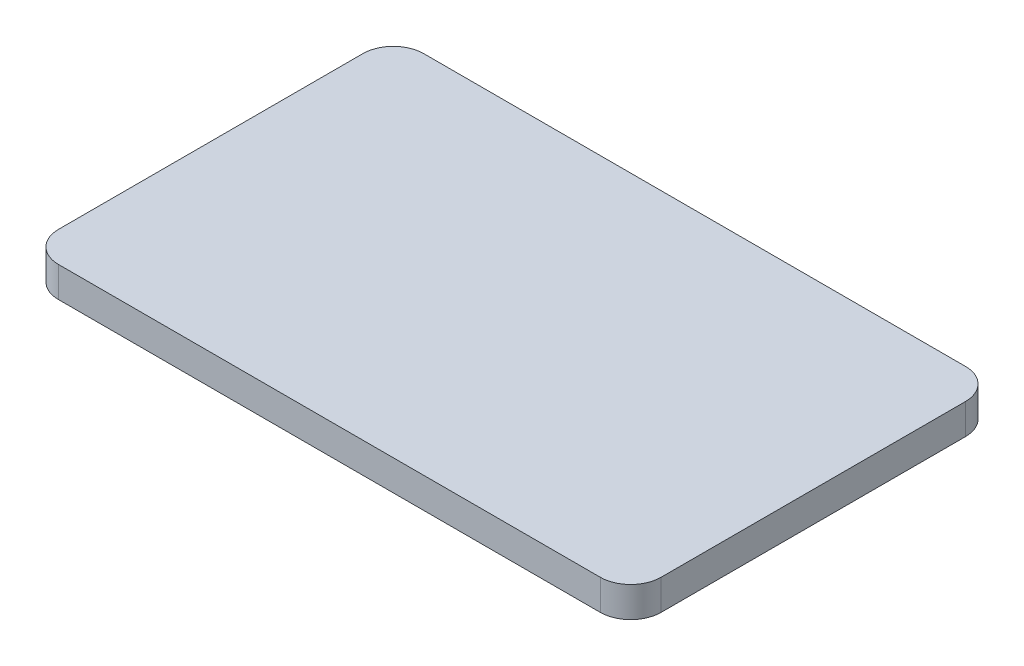
ISO-10303-21;
HEADER;
FILE_DESCRIPTION(('STEP AP214'),'2;1');
FILE_NAME('part.step','',(''),(''),'','','');
FILE_SCHEMA(('AUTOMOTIVE_DESIGN { 1 0 10303 214 1 1 1 1 }'));
ENDSEC;
DATA;
#1=APPLICATION_CONTEXT('core data for automotive mechanical design processes');
#2=APPLICATION_PROTOCOL_DEFINITION('international standard','automotive_design',2000,#1);
#3=PRODUCT_CONTEXT('',#1,'mechanical');
#4=PRODUCT('Part','Part','',(#3));
#5=PRODUCT_RELATED_PRODUCT_CATEGORY('part','',(#4));
#6=PRODUCT_DEFINITION_FORMATION('','',#4);
#7=PRODUCT_DEFINITION_CONTEXT('part definition',#1,'design');
#8=PRODUCT_DEFINITION('design','',#6,#7);
#9=PRODUCT_DEFINITION_SHAPE('','',#8);
#10=(LENGTH_UNIT() NAMED_UNIT(*) SI_UNIT(.MILLI.,.METRE.));
#11=(NAMED_UNIT(*) PLANE_ANGLE_UNIT() SI_UNIT($,.RADIAN.));
#12=(NAMED_UNIT(*) SI_UNIT($,.STERADIAN.) SOLID_ANGLE_UNIT());
#13=UNCERTAINTY_MEASURE_WITH_UNIT(LENGTH_MEASURE(1.E-05),#10,'distance_accuracy_value','');
#14=(GEOMETRIC_REPRESENTATION_CONTEXT(3) GLOBAL_UNCERTAINTY_ASSIGNED_CONTEXT((#13)) GLOBAL_UNIT_ASSIGNED_CONTEXT((#10,
#11,#12)) REPRESENTATION_CONTEXT('',''));
#15=CARTESIAN_POINT('',(0.,0.,0.));
#16=DIRECTION('',(0.,0.,1.));
#17=DIRECTION('',(1.,0.,0.));
#18=AXIS2_PLACEMENT_3D('',#15,#16,#17);
#19=CARTESIAN_POINT('',(44.5,5.,25.));
#20=DIRECTION('',(0.,-1.,0.));
#21=DIRECTION('',(0.,0.,-1.));
#22=AXIS2_PLACEMENT_3D('',#19,#20,#21);
#23=CYLINDRICAL_SURFACE('',#22,5.);
#24=CARTESIAN_POINT('',(44.5,0.,25.));
#25=DIRECTION('',(0.,1.,0.));
#26=DIRECTION('',(0.,0.,-1.));
#27=AXIS2_PLACEMENT_3D('',#24,#25,#26);
#28=CIRCLE('',#27,5.);
#29=CARTESIAN_POINT('',(44.5,0.,30.));
#30=VERTEX_POINT('',#29);
#31=CARTESIAN_POINT('',(49.5,0.,25.));
#32=VERTEX_POINT('',#31);
#33=EDGE_CURVE('E140',#30,#32,#28,.T.);
#34=ORIENTED_EDGE('',*,*,#33,.T.);
#35=DIRECTION('',(0.,-1.,0.));
#36=VECTOR('',#35,1.);
#37=CARTESIAN_POINT('',(49.5,5.,25.));
#38=LINE('',#37,#36);
#39=CARTESIAN_POINT('',(49.5,5.,25.));
#40=VERTEX_POINT('',#39);
#41=EDGE_CURVE('E11',#40,#32,#38,.T.);
#42=ORIENTED_EDGE('',*,*,#41,.F.);
#43=CARTESIAN_POINT('',(44.5,5.,25.));
#44=DIRECTION('',(0.,1.,0.));
#45=DIRECTION('',(0.,0.,-1.));
#46=AXIS2_PLACEMENT_3D('',#43,#44,#45);
#47=CIRCLE('',#46,5.);
#48=CARTESIAN_POINT('',(44.5,5.,30.));
#49=VERTEX_POINT('',#48);
#50=EDGE_CURVE('E162',#49,#40,#47,.T.);
#51=ORIENTED_EDGE('',*,*,#50,.F.);
#52=DIRECTION('',(0.,-1.,0.));
#53=VECTOR('',#52,1.);
#54=CARTESIAN_POINT('',(44.5,5.,30.));
#55=LINE('',#54,#53);
#56=EDGE_CURVE('E136',#49,#30,#55,.T.);
#57=ORIENTED_EDGE('',*,*,#56,.T.);
#58=EDGE_LOOP('',(#34,#42,#51,#57));
#59=FACE_BOUND('',#58,.T.);
#60=ADVANCED_FACE('F39',(#59),#23,.T.);
#61=CARTESIAN_POINT('',(49.5,5.,-25.));
#62=DIRECTION('',(-1.,0.,0.));
#63=DIRECTION('',(0.,0.,1.));
#64=AXIS2_PLACEMENT_3D('',#61,#62,#63);
#65=PLANE('',#64);
#66=DIRECTION('',(0.,0.,-1.));
#67=VECTOR('',#66,1.);
#68=CARTESIAN_POINT('',(49.5,0.,-25.));
#69=LINE('',#68,#67);
#70=CARTESIAN_POINT('',(49.5,0.,-25.));
#71=VERTEX_POINT('',#70);
#72=EDGE_CURVE('E144',#32,#71,#69,.T.);
#73=ORIENTED_EDGE('',*,*,#72,.T.);
#74=DIRECTION('',(0.,-1.,0.));
#75=VECTOR('',#74,1.);
#76=CARTESIAN_POINT('',(49.5,5.,-25.));
#77=LINE('',#76,#75);
#78=CARTESIAN_POINT('',(49.5,5.,-25.));
#79=VERTEX_POINT('',#78);
#80=EDGE_CURVE('E48',#79,#71,#77,.T.);
#81=ORIENTED_EDGE('',*,*,#80,.F.);
#82=DIRECTION('',(0.,0.,-1.));
#83=VECTOR('',#82,1.);
#84=CARTESIAN_POINT('',(49.5,5.,-25.));
#85=LINE('',#84,#83);
#86=EDGE_CURVE('E99',#40,#79,#85,.T.);
#87=ORIENTED_EDGE('',*,*,#86,.F.);
#88=ORIENTED_EDGE('',*,*,#41,.T.);
#89=EDGE_LOOP('',(#73,#81,#87,#88));
#90=FACE_BOUND('',#89,.T.);
#91=ADVANCED_FACE('F208',(#90),#65,.F.);
#92=CARTESIAN_POINT('',(44.5,5.,-25.));
#93=DIRECTION('',(0.,-1.,0.));
#94=DIRECTION('',(0.,0.,-1.));
#95=AXIS2_PLACEMENT_3D('',#92,#93,#94);
#96=CYLINDRICAL_SURFACE('',#95,5.);
#97=CARTESIAN_POINT('',(44.5,0.,-25.));
#98=DIRECTION('',(0.,1.,0.));
#99=DIRECTION('',(0.,0.,-1.));
#100=AXIS2_PLACEMENT_3D('',#97,#98,#99);
#101=CIRCLE('',#100,5.);
#102=CARTESIAN_POINT('',(44.5,0.,-30.));
#103=VERTEX_POINT('',#102);
#104=EDGE_CURVE('E147',#71,#103,#101,.T.);
#105=ORIENTED_EDGE('',*,*,#104,.T.);
#106=DIRECTION('',(0.,-1.,0.));
#107=VECTOR('',#106,1.);
#108=CARTESIAN_POINT('',(44.5,5.,-30.));
#109=LINE('',#108,#107);
#110=CARTESIAN_POINT('',(44.5,5.,-30.));
#111=VERTEX_POINT('',#110);
#112=EDGE_CURVE('E173',#111,#103,#109,.T.);
#113=ORIENTED_EDGE('',*,*,#112,.F.);
#114=CARTESIAN_POINT('',(44.5,5.,-25.));
#115=DIRECTION('',(0.,1.,0.));
#116=DIRECTION('',(0.,0.,-1.));
#117=AXIS2_PLACEMENT_3D('',#114,#115,#116);
#118=CIRCLE('',#117,5.);
#119=EDGE_CURVE('E183',#79,#111,#118,.T.);
#120=ORIENTED_EDGE('',*,*,#119,.F.);
#121=ORIENTED_EDGE('',*,*,#80,.T.);
#122=EDGE_LOOP('',(#105,#113,#120,#121));
#123=FACE_BOUND('',#122,.T.);
#124=ADVANCED_FACE('F181',(#123),#96,.T.);
#125=CARTESIAN_POINT('',(44.5,5.,-30.));
#126=DIRECTION('',(0.,0.,1.));
#127=DIRECTION('',(1.,0.,0.));
#128=AXIS2_PLACEMENT_3D('',#125,#126,#127);
#129=PLANE('',#128);
#130=DIRECTION('',(-1.,0.,0.));
#131=VECTOR('',#130,1.);
#132=CARTESIAN_POINT('',(44.5,0.,-30.));
#133=LINE('',#132,#131);
#134=CARTESIAN_POINT('',(-44.5,0.,-30.));
#135=VERTEX_POINT('',#134);
#136=EDGE_CURVE('E150',#103,#135,#133,.T.);
#137=ORIENTED_EDGE('',*,*,#136,.T.);
#138=DIRECTION('',(0.,-1.,0.));
#139=VECTOR('',#138,1.);
#140=CARTESIAN_POINT('',(-44.5,5.,-30.));
#141=LINE('',#140,#139);
#142=CARTESIAN_POINT('',(-44.5,5.,-30.));
#143=VERTEX_POINT('',#142);
#144=EDGE_CURVE('E169',#143,#135,#141,.T.);
#145=ORIENTED_EDGE('',*,*,#144,.F.);
#146=DIRECTION('',(-1.,0.,0.));
#147=VECTOR('',#146,1.);
#148=CARTESIAN_POINT('',(44.5,5.,-30.));
#149=LINE('',#148,#147);
#150=EDGE_CURVE('E196',#111,#143,#149,.T.);
#151=ORIENTED_EDGE('',*,*,#150,.F.);
#152=ORIENTED_EDGE('',*,*,#112,.T.);
#153=EDGE_LOOP('',(#137,#145,#151,#152));
#154=FACE_BOUND('',#153,.T.);
#155=ADVANCED_FACE('F191',(#154),#129,.F.);
#156=CARTESIAN_POINT('',(-44.5,5.,-25.));
#157=DIRECTION('',(0.,-1.,0.));
#158=DIRECTION('',(0.,0.,-1.));
#159=AXIS2_PLACEMENT_3D('',#156,#157,#158);
#160=CYLINDRICAL_SURFACE('',#159,5.);
#161=CARTESIAN_POINT('',(-44.5,0.,-25.));
#162=DIRECTION('',(0.,1.,0.));
#163=DIRECTION('',(0.,0.,1.));
#164=AXIS2_PLACEMENT_3D('',#161,#162,#163);
#165=CIRCLE('',#164,5.);
#166=CARTESIAN_POINT('',(-49.5,0.,-25.));
#167=VERTEX_POINT('',#166);
#168=EDGE_CURVE('E153',#135,#167,#165,.T.);
#169=ORIENTED_EDGE('',*,*,#168,.T.);
#170=DIRECTION('',(0.,-1.,0.));
#171=VECTOR('',#170,1.);
#172=CARTESIAN_POINT('',(-49.5,5.,-25.));
#173=LINE('',#172,#171);
#174=CARTESIAN_POINT('',(-49.5,5.,-25.));
#175=VERTEX_POINT('',#174);
#176=EDGE_CURVE('E129',#175,#167,#173,.T.);
#177=ORIENTED_EDGE('',*,*,#176,.F.);
#178=CARTESIAN_POINT('',(-44.5,5.,-25.));
#179=DIRECTION('',(0.,1.,0.));
#180=DIRECTION('',(0.,0.,1.));
#181=AXIS2_PLACEMENT_3D('',#178,#179,#180);
#182=CIRCLE('',#181,5.);
#183=EDGE_CURVE('E118',#143,#175,#182,.T.);
#184=ORIENTED_EDGE('',*,*,#183,.F.);
#185=ORIENTED_EDGE('',*,*,#144,.T.);
#186=EDGE_LOOP('',(#169,#177,#184,#185));
#187=FACE_BOUND('',#186,.T.);
#188=ADVANCED_FACE('F194',(#187),#160,.T.);
#189=CARTESIAN_POINT('',(-49.5,5.,-25.));
#190=DIRECTION('',(1.,0.,0.));
#191=DIRECTION('',(0.,0.,-1.));
#192=AXIS2_PLACEMENT_3D('',#189,#190,#191);
#193=PLANE('',#192);
#194=DIRECTION('',(0.,0.,1.));
#195=VECTOR('',#194,1.);
#196=CARTESIAN_POINT('',(-49.5,0.,-25.));
#197=LINE('',#196,#195);
#198=CARTESIAN_POINT('',(-49.5,0.,25.));
#199=VERTEX_POINT('',#198);
#200=EDGE_CURVE('E127',#167,#199,#197,.T.);
#201=ORIENTED_EDGE('',*,*,#200,.T.);
#202=DIRECTION('',(0.,-1.,0.));
#203=VECTOR('',#202,1.);
#204=CARTESIAN_POINT('',(-49.5,5.,25.));
#205=LINE('',#204,#203);
#206=CARTESIAN_POINT('',(-49.5,5.,25.));
#207=VERTEX_POINT('',#206);
#208=EDGE_CURVE('E124',#207,#199,#205,.T.);
#209=ORIENTED_EDGE('',*,*,#208,.F.);
#210=DIRECTION('',(0.,0.,1.));
#211=VECTOR('',#210,1.);
#212=CARTESIAN_POINT('',(-49.5,5.,-25.));
#213=LINE('',#212,#211);
#214=EDGE_CURVE('E112',#175,#207,#213,.T.);
#215=ORIENTED_EDGE('',*,*,#214,.F.);
#216=ORIENTED_EDGE('',*,*,#176,.T.);
#217=EDGE_LOOP('',(#201,#209,#215,#216));
#218=FACE_BOUND('',#217,.T.);
#219=ADVANCED_FACE('F125',(#218),#193,.F.);
#220=CARTESIAN_POINT('',(-44.5,5.,25.));
#221=DIRECTION('',(0.,-1.,0.));
#222=DIRECTION('',(0.,0.,-1.));
#223=AXIS2_PLACEMENT_3D('',#220,#221,#222);
#224=CYLINDRICAL_SURFACE('',#223,5.);
#225=CARTESIAN_POINT('',(-44.5,0.,25.));
#226=DIRECTION('',(0.,1.,0.));
#227=DIRECTION('',(0.,0.,-1.));
#228=AXIS2_PLACEMENT_3D('',#225,#226,#227);
#229=CIRCLE('',#228,5.);
#230=CARTESIAN_POINT('',(-44.5,0.,30.));
#231=VERTEX_POINT('',#230);
#232=EDGE_CURVE('E85',#199,#231,#229,.T.);
#233=ORIENTED_EDGE('',*,*,#232,.T.);
#234=DIRECTION('',(0.,-1.,0.));
#235=VECTOR('',#234,1.);
#236=CARTESIAN_POINT('',(-44.5,5.,30.));
#237=LINE('',#236,#235);
#238=CARTESIAN_POINT('',(-44.5,5.,30.));
#239=VERTEX_POINT('',#238);
#240=EDGE_CURVE('E130',#239,#231,#237,.T.);
#241=ORIENTED_EDGE('',*,*,#240,.F.);
#242=CARTESIAN_POINT('',(-44.5,5.,25.));
#243=DIRECTION('',(0.,1.,0.));
#244=DIRECTION('',(0.,0.,-1.));
#245=AXIS2_PLACEMENT_3D('',#242,#243,#244);
#246=CIRCLE('',#245,5.);
#247=EDGE_CURVE('E116',#207,#239,#246,.T.);
#248=ORIENTED_EDGE('',*,*,#247,.F.);
#249=ORIENTED_EDGE('',*,*,#208,.T.);
#250=EDGE_LOOP('',(#233,#241,#248,#249));
#251=FACE_BOUND('',#250,.T.);
#252=ADVANCED_FACE('F132',(#251),#224,.T.);
#253=CARTESIAN_POINT('',(44.5,5.,30.));
#254=DIRECTION('',(0.,0.,-1.));
#255=DIRECTION('',(-1.,0.,0.));
#256=AXIS2_PLACEMENT_3D('',#253,#254,#255);
#257=PLANE('',#256);
#258=DIRECTION('',(1.,0.,0.));
#259=VECTOR('',#258,1.);
#260=CARTESIAN_POINT('',(44.5,0.,30.));
#261=LINE('',#260,#259);
#262=EDGE_CURVE('E91',#231,#30,#261,.T.);
#263=ORIENTED_EDGE('',*,*,#262,.T.);
#264=ORIENTED_EDGE('',*,*,#56,.F.);
#265=DIRECTION('',(1.,0.,0.));
#266=VECTOR('',#265,1.);
#267=CARTESIAN_POINT('',(44.5,5.,30.));
#268=LINE('',#267,#266);
#269=EDGE_CURVE('E56',#239,#49,#268,.T.);
#270=ORIENTED_EDGE('',*,*,#269,.F.);
#271=ORIENTED_EDGE('',*,*,#240,.T.);
#272=EDGE_LOOP('',(#263,#264,#270,#271));
#273=FACE_BOUND('',#272,.T.);
#274=ADVANCED_FACE('F224',(#273),#257,.F.);
#275=CARTESIAN_POINT('',(44.5,5.,25.));
#276=DIRECTION('',(0.,-1.,0.));
#277=DIRECTION('',(0.,0.,-1.));
#278=AXIS2_PLACEMENT_3D('',#275,#276,#277);
#279=PLANE('',#278);
#280=ORIENTED_EDGE('',*,*,#50,.T.);
#281=ORIENTED_EDGE('',*,*,#86,.T.);
#282=ORIENTED_EDGE('',*,*,#119,.T.);
#283=ORIENTED_EDGE('',*,*,#150,.T.);
#284=ORIENTED_EDGE('',*,*,#183,.T.);
#285=ORIENTED_EDGE('',*,*,#214,.T.);
#286=ORIENTED_EDGE('',*,*,#247,.T.);
#287=ORIENTED_EDGE('',*,*,#269,.T.);
#288=EDGE_LOOP('',(#280,#281,#282,#283,#284,#285,#286,#287));
#289=FACE_BOUND('',#288,.T.);
#290=ADVANCED_FACE('F114',(#289),#279,.F.);
#291=CARTESIAN_POINT('',(44.5,0.,25.));
#292=DIRECTION('',(0.,-1.,0.));
#293=DIRECTION('',(0.,0.,-1.));
#294=AXIS2_PLACEMENT_3D('',#291,#292,#293);
#295=PLANE('',#294);
#296=ORIENTED_EDGE('',*,*,#33,.F.);
#297=ORIENTED_EDGE('',*,*,#262,.F.);
#298=ORIENTED_EDGE('',*,*,#232,.F.);
#299=ORIENTED_EDGE('',*,*,#200,.F.);
#300=ORIENTED_EDGE('',*,*,#168,.F.);
#301=ORIENTED_EDGE('',*,*,#136,.F.);
#302=ORIENTED_EDGE('',*,*,#104,.F.);
#303=ORIENTED_EDGE('',*,*,#72,.F.);
#304=EDGE_LOOP('',(#296,#297,#298,#299,#300,#301,#302,#303));
#305=FACE_BOUND('',#304,.T.);
#306=ADVANCED_FACE('F187',(#305),#295,.T.);
#307=CLOSED_SHELL('',(#60,#91,#124,#155,#188,#219,#252,#274,#290,#306));
#308=MANIFOLD_SOLID_BREP('B2',#307);
#309=ADVANCED_BREP_SHAPE_REPRESENTATION('',(#18,#308),#14);
#310=SHAPE_DEFINITION_REPRESENTATION(#9,#309);
ENDSEC;
END-ISO-10303-21;
